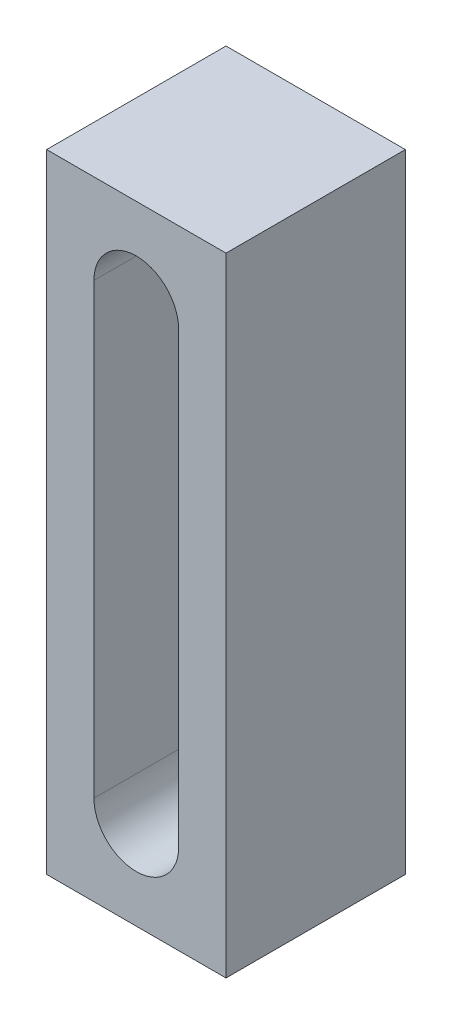
ISO-10303-21;
HEADER;
FILE_DESCRIPTION(('STEP AP214'),'2;1');
FILE_NAME('part.step','',(''),(''),'','','');
FILE_SCHEMA(('AUTOMOTIVE_DESIGN { 1 0 10303 214 1 1 1 1 }'));
ENDSEC;
DATA;
#1=APPLICATION_CONTEXT('core data for automotive mechanical design processes');
#2=APPLICATION_PROTOCOL_DEFINITION('international standard','automotive_design',2000,#1);
#3=PRODUCT_CONTEXT('',#1,'mechanical');
#4=PRODUCT('Part','Part','',(#3));
#5=PRODUCT_RELATED_PRODUCT_CATEGORY('part','',(#4));
#6=PRODUCT_DEFINITION_FORMATION('','',#4);
#7=PRODUCT_DEFINITION_CONTEXT('part definition',#1,'design');
#8=PRODUCT_DEFINITION('design','',#6,#7);
#9=PRODUCT_DEFINITION_SHAPE('','',#8);
#10=(LENGTH_UNIT() NAMED_UNIT(*) SI_UNIT(.MILLI.,.METRE.));
#11=(NAMED_UNIT(*) PLANE_ANGLE_UNIT() SI_UNIT($,.RADIAN.));
#12=(NAMED_UNIT(*) SI_UNIT($,.STERADIAN.) SOLID_ANGLE_UNIT());
#13=UNCERTAINTY_MEASURE_WITH_UNIT(LENGTH_MEASURE(1.E-05),#10,'distance_accuracy_value','');
#14=(GEOMETRIC_REPRESENTATION_CONTEXT(3) GLOBAL_UNCERTAINTY_ASSIGNED_CONTEXT((#13)) GLOBAL_UNIT_ASSIGNED_CONTEXT((#10,
#11,#12)) REPRESENTATION_CONTEXT('',''));
#15=CARTESIAN_POINT('',(0.,0.,0.));
#16=DIRECTION('',(0.,0.,1.));
#17=DIRECTION('',(1.,0.,0.));
#18=AXIS2_PLACEMENT_3D('',#15,#16,#17);
#19=CARTESIAN_POINT('',(0.,0.,3.175));
#20=DIRECTION('',(0.,0.,1.));
#21=DIRECTION('',(1.,0.,0.));
#22=AXIS2_PLACEMENT_3D('',#19,#20,#21);
#23=PLANE('',#22);
#24=DIRECTION('',(0.,-1.,0.));
#25=VECTOR('',#24,1.);
#26=CARTESIAN_POINT('',(-3.175,-11.1125,3.175));
#27=LINE('',#26,#25);
#28=CARTESIAN_POINT('',(-3.175,11.1125,3.175));
#29=VERTEX_POINT('',#28);
#30=CARTESIAN_POINT('',(-3.175,-11.1125,3.175));
#31=VERTEX_POINT('',#30);
#32=EDGE_CURVE('E159',#29,#31,#27,.T.);
#33=ORIENTED_EDGE('',*,*,#32,.T.);
#34=DIRECTION('',(1.,0.,0.));
#35=VECTOR('',#34,1.);
#36=CARTESIAN_POINT('',(3.175,-11.1125,3.175));
#37=LINE('',#36,#35);
#38=CARTESIAN_POINT('',(3.175,-11.1125,3.175));
#39=VERTEX_POINT('',#38);
#40=EDGE_CURVE('E163',#31,#39,#37,.T.);
#41=ORIENTED_EDGE('',*,*,#40,.T.);
#42=DIRECTION('',(0.,1.,0.));
#43=VECTOR('',#42,1.);
#44=CARTESIAN_POINT('',(3.175,-11.1125,3.175));
#45=LINE('',#44,#43);
#46=CARTESIAN_POINT('',(3.175,11.1125,3.175));
#47=VERTEX_POINT('',#46);
#48=EDGE_CURVE('E167',#39,#47,#45,.T.);
#49=ORIENTED_EDGE('',*,*,#48,.T.);
#50=DIRECTION('',(-1.,0.,0.));
#51=VECTOR('',#50,1.);
#52=CARTESIAN_POINT('',(3.175,11.1125,3.175));
#53=LINE('',#52,#51);
#54=EDGE_CURVE('E170',#47,#29,#53,.T.);
#55=ORIENTED_EDGE('',*,*,#54,.T.);
#56=EDGE_LOOP('',(#33,#41,#49,#55));
#57=FACE_BOUND('',#56,.T.);
#58=DIRECTION('',(0.,1.,0.));
#59=VECTOR('',#58,1.);
#60=CARTESIAN_POINT('',(1.5,-7.9375,3.175));
#61=LINE('',#60,#59);
#62=CARTESIAN_POINT('',(1.5,-7.9375,3.175));
#63=VERTEX_POINT('',#62);
#64=CARTESIAN_POINT('',(1.5,7.9375,3.175));
#65=VERTEX_POINT('',#64);
#66=EDGE_CURVE('E120',#63,#65,#61,.T.);
#67=ORIENTED_EDGE('',*,*,#66,.F.);
#68=CARTESIAN_POINT('',(0.,-7.9375,3.175));
#69=DIRECTION('',(0.,0.,1.));
#70=DIRECTION('',(1.,0.,0.));
#71=AXIS2_PLACEMENT_3D('',#68,#69,#70);
#72=CIRCLE('',#71,1.5);
#73=CARTESIAN_POINT('',(-1.5,-7.9375,3.175));
#74=VERTEX_POINT('',#73);
#75=EDGE_CURVE('E111',#74,#63,#72,.T.);
#76=ORIENTED_EDGE('',*,*,#75,.F.);
#77=DIRECTION('',(0.,-1.,0.));
#78=VECTOR('',#77,1.);
#79=CARTESIAN_POINT('',(-1.5,-7.9375,3.175));
#80=LINE('',#79,#78);
#81=CARTESIAN_POINT('',(-1.5,7.9375,3.175));
#82=VERTEX_POINT('',#81);
#83=EDGE_CURVE('E137',#82,#74,#80,.T.);
#84=ORIENTED_EDGE('',*,*,#83,.F.);
#85=CARTESIAN_POINT('',(0.,7.9375,3.175));
#86=DIRECTION('',(0.,0.,1.));
#87=DIRECTION('',(1.,0.,0.));
#88=AXIS2_PLACEMENT_3D('',#85,#86,#87);
#89=CIRCLE('',#88,1.5);
#90=EDGE_CURVE('E133',#65,#82,#89,.T.);
#91=ORIENTED_EDGE('',*,*,#90,.F.);
#92=EDGE_LOOP('',(#67,#76,#84,#91));
#93=FACE_BOUND('',#92,.T.);
#94=ADVANCED_FACE('F45',(#57,#93),#23,.T.);
#95=CARTESIAN_POINT('',(0.,0.,-3.175));
#96=DIRECTION('',(0.,0.,1.));
#97=DIRECTION('',(1.,0.,0.));
#98=AXIS2_PLACEMENT_3D('',#95,#96,#97);
#99=PLANE('',#98);
#100=DIRECTION('',(0.,-1.,0.));
#101=VECTOR('',#100,1.);
#102=CARTESIAN_POINT('',(-3.175,-11.1125,-3.175));
#103=LINE('',#102,#101);
#104=CARTESIAN_POINT('',(-3.175,11.1125,-3.175));
#105=VERTEX_POINT('',#104);
#106=CARTESIAN_POINT('',(-3.175,-11.1125,-3.175));
#107=VERTEX_POINT('',#106);
#108=EDGE_CURVE('E129',#105,#107,#103,.T.);
#109=ORIENTED_EDGE('',*,*,#108,.F.);
#110=DIRECTION('',(-1.,0.,0.));
#111=VECTOR('',#110,1.);
#112=CARTESIAN_POINT('',(3.175,11.1125,-3.175));
#113=LINE('',#112,#111);
#114=CARTESIAN_POINT('',(3.175,11.1125,-3.175));
#115=VERTEX_POINT('',#114);
#116=EDGE_CURVE('E164',#115,#105,#113,.T.);
#117=ORIENTED_EDGE('',*,*,#116,.F.);
#118=DIRECTION('',(0.,1.,0.));
#119=VECTOR('',#118,1.);
#120=CARTESIAN_POINT('',(3.175,-11.1125,-3.175));
#121=LINE('',#120,#119);
#122=CARTESIAN_POINT('',(3.175,-11.1125,-3.175));
#123=VERTEX_POINT('',#122);
#124=EDGE_CURVE('E180',#123,#115,#121,.T.);
#125=ORIENTED_EDGE('',*,*,#124,.F.);
#126=DIRECTION('',(1.,0.,0.));
#127=VECTOR('',#126,1.);
#128=CARTESIAN_POINT('',(3.175,-11.1125,-3.175));
#129=LINE('',#128,#127);
#130=EDGE_CURVE('E177',#107,#123,#129,.T.);
#131=ORIENTED_EDGE('',*,*,#130,.F.);
#132=EDGE_LOOP('',(#109,#117,#125,#131));
#133=FACE_BOUND('',#132,.T.);
#134=CARTESIAN_POINT('',(0.,-7.9375,-3.175));
#135=DIRECTION('',(0.,0.,1.));
#136=DIRECTION('',(1.,0.,0.));
#137=AXIS2_PLACEMENT_3D('',#134,#135,#136);
#138=CIRCLE('',#137,1.5);
#139=CARTESIAN_POINT('',(-1.5,-7.9375,-3.175));
#140=VERTEX_POINT('',#139);
#141=CARTESIAN_POINT('',(1.5,-7.9375,-3.175));
#142=VERTEX_POINT('',#141);
#143=EDGE_CURVE('E69',#140,#142,#138,.T.);
#144=ORIENTED_EDGE('',*,*,#143,.T.);
#145=DIRECTION('',(0.,1.,0.));
#146=VECTOR('',#145,1.);
#147=CARTESIAN_POINT('',(1.5,-7.9375,-3.175));
#148=LINE('',#147,#146);
#149=CARTESIAN_POINT('',(1.5,7.9375,-3.175));
#150=VERTEX_POINT('',#149);
#151=EDGE_CURVE('E127',#142,#150,#148,.T.);
#152=ORIENTED_EDGE('',*,*,#151,.T.);
#153=CARTESIAN_POINT('',(0.,7.9375,-3.175));
#154=DIRECTION('',(0.,0.,1.));
#155=DIRECTION('',(1.,0.,0.));
#156=AXIS2_PLACEMENT_3D('',#153,#154,#155);
#157=CIRCLE('',#156,1.5);
#158=CARTESIAN_POINT('',(-1.5,7.9375,-3.175));
#159=VERTEX_POINT('',#158);
#160=EDGE_CURVE('E146',#150,#159,#157,.T.);
#161=ORIENTED_EDGE('',*,*,#160,.T.);
#162=DIRECTION('',(0.,-1.,0.));
#163=VECTOR('',#162,1.);
#164=CARTESIAN_POINT('',(-1.5,-7.9375,-3.175));
#165=LINE('',#164,#163);
#166=EDGE_CURVE('E121',#159,#140,#165,.T.);
#167=ORIENTED_EDGE('',*,*,#166,.T.);
#168=EDGE_LOOP('',(#144,#152,#161,#167));
#169=FACE_BOUND('',#168,.T.);
#170=ADVANCED_FACE('F203',(#133,#169),#99,.F.);
#171=CARTESIAN_POINT('',(-3.175,-11.1125,3.175));
#172=DIRECTION('',(1.,0.,0.));
#173=DIRECTION('',(0.,0.,-1.));
#174=AXIS2_PLACEMENT_3D('',#171,#172,#173);
#175=PLANE('',#174);
#176=ORIENTED_EDGE('',*,*,#108,.T.);
#177=DIRECTION('',(0.,0.,-1.));
#178=VECTOR('',#177,1.);
#179=CARTESIAN_POINT('',(-3.175,-11.1125,3.175));
#180=LINE('',#179,#178);
#181=EDGE_CURVE('E11',#31,#107,#180,.T.);
#182=ORIENTED_EDGE('',*,*,#181,.F.);
#183=ORIENTED_EDGE('',*,*,#32,.F.);
#184=DIRECTION('',(0.,0.,-1.));
#185=VECTOR('',#184,1.);
#186=CARTESIAN_POINT('',(-3.175,11.1125,3.175));
#187=LINE('',#186,#185);
#188=EDGE_CURVE('E173',#29,#105,#187,.T.);
#189=ORIENTED_EDGE('',*,*,#188,.T.);
#190=EDGE_LOOP('',(#176,#182,#183,#189));
#191=FACE_BOUND('',#190,.T.);
#192=ADVANCED_FACE('F47',(#191),#175,.F.);
#193=CARTESIAN_POINT('',(3.175,-11.1125,3.175));
#194=DIRECTION('',(0.,1.,0.));
#195=DIRECTION('',(0.,0.,1.));
#196=AXIS2_PLACEMENT_3D('',#193,#194,#195);
#197=PLANE('',#196);
#198=ORIENTED_EDGE('',*,*,#130,.T.);
#199=DIRECTION('',(0.,0.,-1.));
#200=VECTOR('',#199,1.);
#201=CARTESIAN_POINT('',(3.175,-11.1125,3.175));
#202=LINE('',#201,#200);
#203=EDGE_CURVE('E54',#39,#123,#202,.T.);
#204=ORIENTED_EDGE('',*,*,#203,.F.);
#205=ORIENTED_EDGE('',*,*,#40,.F.);
#206=ORIENTED_EDGE('',*,*,#181,.T.);
#207=EDGE_LOOP('',(#198,#204,#205,#206));
#208=FACE_BOUND('',#207,.T.);
#209=ADVANCED_FACE('F213',(#208),#197,.F.);
#210=CARTESIAN_POINT('',(3.175,-11.1125,3.175));
#211=DIRECTION('',(-1.,0.,0.));
#212=DIRECTION('',(0.,0.,1.));
#213=AXIS2_PLACEMENT_3D('',#210,#211,#212);
#214=PLANE('',#213);
#215=ORIENTED_EDGE('',*,*,#124,.T.);
#216=DIRECTION('',(0.,0.,-1.));
#217=VECTOR('',#216,1.);
#218=CARTESIAN_POINT('',(3.175,11.1125,3.175));
#219=LINE('',#218,#217);
#220=EDGE_CURVE('E188',#47,#115,#219,.T.);
#221=ORIENTED_EDGE('',*,*,#220,.F.);
#222=ORIENTED_EDGE('',*,*,#48,.F.);
#223=ORIENTED_EDGE('',*,*,#203,.T.);
#224=EDGE_LOOP('',(#215,#221,#222,#223));
#225=FACE_BOUND('',#224,.T.);
#226=ADVANCED_FACE('F197',(#225),#214,.F.);
#227=CARTESIAN_POINT('',(3.175,11.1125,3.175));
#228=DIRECTION('',(0.,-1.,0.));
#229=DIRECTION('',(0.,0.,-1.));
#230=AXIS2_PLACEMENT_3D('',#227,#228,#229);
#231=PLANE('',#230);
#232=ORIENTED_EDGE('',*,*,#116,.T.);
#233=ORIENTED_EDGE('',*,*,#188,.F.);
#234=ORIENTED_EDGE('',*,*,#54,.F.);
#235=ORIENTED_EDGE('',*,*,#220,.T.);
#236=EDGE_LOOP('',(#232,#233,#234,#235));
#237=FACE_BOUND('',#236,.T.);
#238=ADVANCED_FACE('F207',(#237),#231,.F.);
#239=CARTESIAN_POINT('',(0.,-7.9375,3.175));
#240=DIRECTION('',(0.,0.,-1.));
#241=DIRECTION('',(-1.,0.,0.));
#242=AXIS2_PLACEMENT_3D('',#239,#240,#241);
#243=CYLINDRICAL_SURFACE('',#242,1.5);
#244=ORIENTED_EDGE('',*,*,#143,.F.);
#245=DIRECTION('',(0.,0.,-1.));
#246=VECTOR('',#245,1.);
#247=CARTESIAN_POINT('',(-1.5,-7.9375,3.175));
#248=LINE('',#247,#246);
#249=EDGE_CURVE('E115',#74,#140,#248,.T.);
#250=ORIENTED_EDGE('',*,*,#249,.F.);
#251=ORIENTED_EDGE('',*,*,#75,.T.);
#252=DIRECTION('',(0.,0.,-1.));
#253=VECTOR('',#252,1.);
#254=CARTESIAN_POINT('',(1.5,-7.9375,3.175));
#255=LINE('',#254,#253);
#256=EDGE_CURVE('E114',#63,#142,#255,.T.);
#257=ORIENTED_EDGE('',*,*,#256,.T.);
#258=EDGE_LOOP('',(#244,#250,#251,#257));
#259=FACE_BOUND('',#258,.T.);
#260=ADVANCED_FACE('F113',(#259),#243,.F.);
#261=CARTESIAN_POINT('',(1.5,-7.9375,3.175));
#262=DIRECTION('',(-1.,0.,0.));
#263=DIRECTION('',(0.,0.,1.));
#264=AXIS2_PLACEMENT_3D('',#261,#262,#263);
#265=PLANE('',#264);
#266=ORIENTED_EDGE('',*,*,#151,.F.);
#267=ORIENTED_EDGE('',*,*,#256,.F.);
#268=ORIENTED_EDGE('',*,*,#66,.T.);
#269=DIRECTION('',(0.,0.,-1.));
#270=VECTOR('',#269,1.);
#271=CARTESIAN_POINT('',(1.5,7.9375,3.175));
#272=LINE('',#271,#270);
#273=EDGE_CURVE('E130',#65,#150,#272,.T.);
#274=ORIENTED_EDGE('',*,*,#273,.T.);
#275=EDGE_LOOP('',(#266,#267,#268,#274));
#276=FACE_BOUND('',#275,.T.);
#277=ADVANCED_FACE('F124',(#276),#265,.T.);
#278=CARTESIAN_POINT('',(0.,7.9375,3.175));
#279=DIRECTION('',(0.,0.,-1.));
#280=DIRECTION('',(-1.,0.,0.));
#281=AXIS2_PLACEMENT_3D('',#278,#279,#280);
#282=CYLINDRICAL_SURFACE('',#281,1.5);
#283=ORIENTED_EDGE('',*,*,#160,.F.);
#284=ORIENTED_EDGE('',*,*,#273,.F.);
#285=ORIENTED_EDGE('',*,*,#90,.T.);
#286=DIRECTION('',(0.,0.,-1.));
#287=VECTOR('',#286,1.);
#288=CARTESIAN_POINT('',(-1.5,7.9375,3.175));
#289=LINE('',#288,#287);
#290=EDGE_CURVE('E61',#82,#159,#289,.T.);
#291=ORIENTED_EDGE('',*,*,#290,.T.);
#292=EDGE_LOOP('',(#283,#284,#285,#291));
#293=FACE_BOUND('',#292,.T.);
#294=ADVANCED_FACE('F236',(#293),#282,.F.);
#295=CARTESIAN_POINT('',(-1.5,-7.9375,3.175));
#296=DIRECTION('',(1.,0.,0.));
#297=DIRECTION('',(0.,0.,-1.));
#298=AXIS2_PLACEMENT_3D('',#295,#296,#297);
#299=PLANE('',#298);
#300=ORIENTED_EDGE('',*,*,#166,.F.);
#301=ORIENTED_EDGE('',*,*,#290,.F.);
#302=ORIENTED_EDGE('',*,*,#83,.T.);
#303=ORIENTED_EDGE('',*,*,#249,.T.);
#304=EDGE_LOOP('',(#300,#301,#302,#303));
#305=FACE_BOUND('',#304,.T.);
#306=ADVANCED_FACE('F240',(#305),#299,.T.);
#307=CLOSED_SHELL('',(#94,#170,#192,#209,#226,#238,#260,#277,#294,#306));
#308=MANIFOLD_SOLID_BREP('B2',#307);
#309=ADVANCED_BREP_SHAPE_REPRESENTATION('',(#18,#308),#14);
#310=SHAPE_DEFINITION_REPRESENTATION(#9,#309);
ENDSEC;
END-ISO-10303-21;
